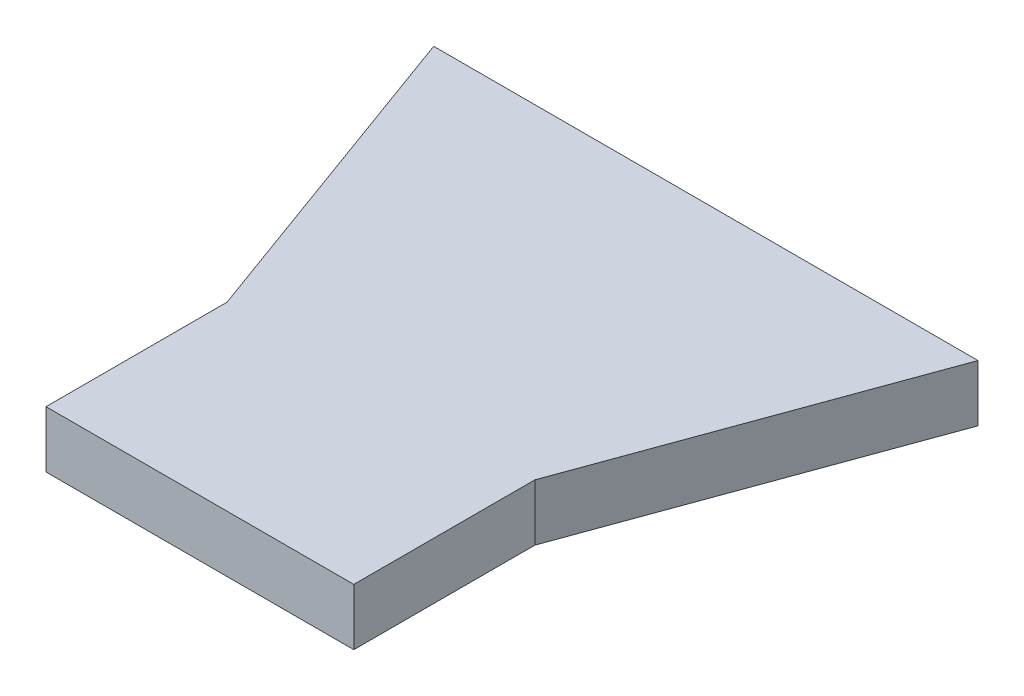
ISO-10303-21;
HEADER;
FILE_DESCRIPTION(('STEP AP214'),'2;1');
FILE_NAME('part.step','',(''),(''),'','','');
FILE_SCHEMA(('AUTOMOTIVE_DESIGN { 1 0 10303 214 1 1 1 1 }'));
ENDSEC;
DATA;
#1=APPLICATION_CONTEXT('core data for automotive mechanical design processes');
#2=APPLICATION_PROTOCOL_DEFINITION('international standard','automotive_design',2000,#1);
#3=PRODUCT_CONTEXT('',#1,'mechanical');
#4=PRODUCT('Part','Part','',(#3));
#5=PRODUCT_RELATED_PRODUCT_CATEGORY('part','',(#4));
#6=PRODUCT_DEFINITION_FORMATION('','',#4);
#7=PRODUCT_DEFINITION_CONTEXT('part definition',#1,'design');
#8=PRODUCT_DEFINITION('design','',#6,#7);
#9=PRODUCT_DEFINITION_SHAPE('','',#8);
#10=(LENGTH_UNIT() NAMED_UNIT(*) SI_UNIT(.MILLI.,.METRE.));
#11=(NAMED_UNIT(*) PLANE_ANGLE_UNIT() SI_UNIT($,.RADIAN.));
#12=(NAMED_UNIT(*) SI_UNIT($,.STERADIAN.) SOLID_ANGLE_UNIT());
#13=UNCERTAINTY_MEASURE_WITH_UNIT(LENGTH_MEASURE(1.E-05),#10,'distance_accuracy_value','');
#14=(GEOMETRIC_REPRESENTATION_CONTEXT(3) GLOBAL_UNCERTAINTY_ASSIGNED_CONTEXT((#13)) GLOBAL_UNIT_ASSIGNED_CONTEXT((#10,
#11,#12)) REPRESENTATION_CONTEXT('',''));
#15=CARTESIAN_POINT('',(0.,0.,0.));
#16=DIRECTION('',(0.,0.,1.));
#17=DIRECTION('',(1.,0.,0.));
#18=AXIS2_PLACEMENT_3D('',#15,#16,#17);
#19=CARTESIAN_POINT('',(0.,25.,0.));
#20=DIRECTION('',(1.,0.,0.));
#21=DIRECTION('',(0.,0.,-1.));
#22=AXIS2_PLACEMENT_3D('',#19,#20,#21);
#23=PLANE('',#22);
#24=DIRECTION('',(0.,0.,1.));
#25=VECTOR('',#24,1.);
#26=CARTESIAN_POINT('',(0.,0.,0.));
#27=LINE('',#26,#25);
#28=CARTESIAN_POINT('',(0.,0.,-80.));
#29=VERTEX_POINT('',#28);
#30=CARTESIAN_POINT('',(0.,0.,0.));
#31=VERTEX_POINT('',#30);
#32=EDGE_CURVE('E127',#29,#31,#27,.T.);
#33=ORIENTED_EDGE('',*,*,#32,.T.);
#34=DIRECTION('',(0.,-1.,0.));
#35=VECTOR('',#34,1.);
#36=CARTESIAN_POINT('',(0.,25.,0.));
#37=LINE('',#36,#35);
#38=CARTESIAN_POINT('',(0.,25.,0.));
#39=VERTEX_POINT('',#38);
#40=EDGE_CURVE('E11',#39,#31,#37,.T.);
#41=ORIENTED_EDGE('',*,*,#40,.F.);
#42=DIRECTION('',(0.,0.,1.));
#43=VECTOR('',#42,1.);
#44=CARTESIAN_POINT('',(0.,25.,0.));
#45=LINE('',#44,#43);
#46=CARTESIAN_POINT('',(0.,25.,-80.));
#47=VERTEX_POINT('',#46);
#48=EDGE_CURVE('E137',#47,#39,#45,.T.);
#49=ORIENTED_EDGE('',*,*,#48,.F.);
#50=DIRECTION('',(0.,-1.,0.));
#51=VECTOR('',#50,1.);
#52=CARTESIAN_POINT('',(0.,25.,-80.));
#53=LINE('',#52,#51);
#54=EDGE_CURVE('E123',#47,#29,#53,.T.);
#55=ORIENTED_EDGE('',*,*,#54,.T.);
#56=EDGE_LOOP('',(#33,#41,#49,#55));
#57=FACE_BOUND('',#56,.T.);
#58=ADVANCED_FACE('F43',(#57),#23,.F.);
#59=CARTESIAN_POINT('',(0.,25.,0.));
#60=DIRECTION('',(0.,0.,-1.));
#61=DIRECTION('',(-1.,0.,0.));
#62=AXIS2_PLACEMENT_3D('',#59,#60,#61);
#63=PLANE('',#62);
#64=DIRECTION('',(1.,0.,0.));
#65=VECTOR('',#64,1.);
#66=CARTESIAN_POINT('',(0.,0.,0.));
#67=LINE('',#66,#65);
#68=CARTESIAN_POINT('',(136.,0.,0.));
#69=VERTEX_POINT('',#68);
#70=EDGE_CURVE('E130',#31,#69,#67,.T.);
#71=ORIENTED_EDGE('',*,*,#70,.T.);
#72=DIRECTION('',(0.,-1.,0.));
#73=VECTOR('',#72,1.);
#74=CARTESIAN_POINT('',(136.,25.,0.));
#75=LINE('',#74,#73);
#76=CARTESIAN_POINT('',(136.,25.,0.));
#77=VERTEX_POINT('',#76);
#78=EDGE_CURVE('E51',#77,#69,#75,.T.);
#79=ORIENTED_EDGE('',*,*,#78,.F.);
#80=DIRECTION('',(1.,0.,0.));
#81=VECTOR('',#80,1.);
#82=CARTESIAN_POINT('',(0.,25.,0.));
#83=LINE('',#82,#81);
#84=EDGE_CURVE('E96',#39,#77,#83,.T.);
#85=ORIENTED_EDGE('',*,*,#84,.F.);
#86=ORIENTED_EDGE('',*,*,#40,.T.);
#87=EDGE_LOOP('',(#71,#79,#85,#86));
#88=FACE_BOUND('',#87,.T.);
#89=ADVANCED_FACE('F161',(#88),#63,.F.);
#90=CARTESIAN_POINT('',(136.,25.,0.));
#91=DIRECTION('',(-1.,0.,0.));
#92=DIRECTION('',(0.,0.,1.));
#93=AXIS2_PLACEMENT_3D('',#90,#91,#92);
#94=PLANE('',#93);
#95=DIRECTION('',(0.,0.,-1.));
#96=VECTOR('',#95,1.);
#97=CARTESIAN_POINT('',(136.,0.,0.));
#98=LINE('',#97,#96);
#99=CARTESIAN_POINT('',(136.,0.,-80.));
#100=VERTEX_POINT('',#99);
#101=EDGE_CURVE('E132',#69,#100,#98,.T.);
#102=ORIENTED_EDGE('',*,*,#101,.T.);
#103=DIRECTION('',(0.,-1.,0.));
#104=VECTOR('',#103,1.);
#105=CARTESIAN_POINT('',(136.,25.,-80.));
#106=LINE('',#105,#104);
#107=CARTESIAN_POINT('',(136.,25.,-80.));
#108=VERTEX_POINT('',#107);
#109=EDGE_CURVE('E118',#108,#100,#106,.T.);
#110=ORIENTED_EDGE('',*,*,#109,.F.);
#111=DIRECTION('',(0.,0.,-1.));
#112=VECTOR('',#111,1.);
#113=CARTESIAN_POINT('',(136.,25.,0.));
#114=LINE('',#113,#112);
#115=EDGE_CURVE('E109',#77,#108,#114,.T.);
#116=ORIENTED_EDGE('',*,*,#115,.F.);
#117=ORIENTED_EDGE('',*,*,#78,.T.);
#118=EDGE_LOOP('',(#102,#110,#116,#117));
#119=FACE_BOUND('',#118,.T.);
#120=ADVANCED_FACE('F143',(#119),#94,.F.);
#121=CARTESIAN_POINT('',(188.253518922524,25.,-223.565363326681));
#122=DIRECTION('',(-0.93969262078591,0.,-0.342020143325664));
#123=DIRECTION('',(-0.342020143325664,0.,0.93969262078591));
#124=AXIS2_PLACEMENT_3D('',#121,#122,#123);
#125=PLANE('',#124);
#126=DIRECTION('',(0.342020143325664,0.,-0.93969262078591));
#127=VECTOR('',#126,1.);
#128=CARTESIAN_POINT('',(188.253518922524,0.,-223.565363326681));
#129=LINE('',#128,#127);
#130=CARTESIAN_POINT('',(188.253518922524,0.,-223.565363326681));
#131=VERTEX_POINT('',#130);
#132=EDGE_CURVE('E117',#100,#131,#129,.T.);
#133=ORIENTED_EDGE('',*,*,#132,.T.);
#134=DIRECTION('',(0.,-1.,0.));
#135=VECTOR('',#134,1.);
#136=CARTESIAN_POINT('',(188.253518922524,25.,-223.565363326681));
#137=LINE('',#136,#135);
#138=CARTESIAN_POINT('',(188.253518922524,25.,-223.565363326681));
#139=VERTEX_POINT('',#138);
#140=EDGE_CURVE('E114',#139,#131,#137,.T.);
#141=ORIENTED_EDGE('',*,*,#140,.F.);
#142=DIRECTION('',(0.342020143325664,0.,-0.93969262078591));
#143=VECTOR('',#142,1.);
#144=CARTESIAN_POINT('',(188.253518922524,25.,-223.565363326681));
#145=LINE('',#144,#143);
#146=EDGE_CURVE('E103',#108,#139,#145,.T.);
#147=ORIENTED_EDGE('',*,*,#146,.F.);
#148=ORIENTED_EDGE('',*,*,#109,.T.);
#149=EDGE_LOOP('',(#133,#141,#147,#148));
#150=FACE_BOUND('',#149,.T.);
#151=ADVANCED_FACE('F115',(#150),#125,.F.);
#152=CARTESIAN_POINT('',(-52.2535189225237,25.,-223.565363326681));
#153=DIRECTION('',(0.,0.,1.));
#154=DIRECTION('',(1.,0.,0.));
#155=AXIS2_PLACEMENT_3D('',#152,#153,#154);
#156=PLANE('',#155);
#157=DIRECTION('',(-1.,0.,0.));
#158=VECTOR('',#157,1.);
#159=CARTESIAN_POINT('',(-52.2535189225237,0.,-223.565363326681));
#160=LINE('',#159,#158);
#161=CARTESIAN_POINT('',(-52.2535189225237,0.,-223.565363326681));
#162=VERTEX_POINT('',#161);
#163=EDGE_CURVE('E82',#131,#162,#160,.T.);
#164=ORIENTED_EDGE('',*,*,#163,.T.);
#165=DIRECTION('',(0.,-1.,0.));
#166=VECTOR('',#165,1.);
#167=CARTESIAN_POINT('',(-52.2535189225237,25.,-223.565363326681));
#168=LINE('',#167,#166);
#169=CARTESIAN_POINT('',(-52.2535189225237,25.,-223.565363326681));
#170=VERTEX_POINT('',#169);
#171=EDGE_CURVE('E119',#170,#162,#168,.T.);
#172=ORIENTED_EDGE('',*,*,#171,.F.);
#173=DIRECTION('',(-1.,0.,0.));
#174=VECTOR('',#173,1.);
#175=CARTESIAN_POINT('',(-52.2535189225237,25.,-223.565363326681));
#176=LINE('',#175,#174);
#177=EDGE_CURVE('E107',#139,#170,#176,.T.);
#178=ORIENTED_EDGE('',*,*,#177,.F.);
#179=ORIENTED_EDGE('',*,*,#140,.T.);
#180=EDGE_LOOP('',(#164,#172,#178,#179));
#181=FACE_BOUND('',#180,.T.);
#182=ADVANCED_FACE('F121',(#181),#156,.F.);
#183=CARTESIAN_POINT('',(0.,25.,-80.));
#184=DIRECTION('',(0.93969262078591,0.,-0.342020143325664));
#185=DIRECTION('',(-0.342020143325664,0.,-0.93969262078591));
#186=AXIS2_PLACEMENT_3D('',#183,#184,#185);
#187=PLANE('',#186);
#188=DIRECTION('',(0.342020143325664,0.,0.93969262078591));
#189=VECTOR('',#188,1.);
#190=CARTESIAN_POINT('',(0.,0.,-80.));
#191=LINE('',#190,#189);
#192=EDGE_CURVE('E88',#162,#29,#191,.T.);
#193=ORIENTED_EDGE('',*,*,#192,.T.);
#194=ORIENTED_EDGE('',*,*,#54,.F.);
#195=DIRECTION('',(0.342020143325664,0.,0.93969262078591));
#196=VECTOR('',#195,1.);
#197=CARTESIAN_POINT('',(0.,25.,-80.));
#198=LINE('',#197,#196);
#199=EDGE_CURVE('E59',#170,#47,#198,.T.);
#200=ORIENTED_EDGE('',*,*,#199,.F.);
#201=ORIENTED_EDGE('',*,*,#171,.T.);
#202=EDGE_LOOP('',(#193,#194,#200,#201));
#203=FACE_BOUND('',#202,.T.);
#204=ADVANCED_FACE('F150',(#203),#187,.F.);
#205=CARTESIAN_POINT('',(0.,25.,0.));
#206=DIRECTION('',(0.,-1.,0.));
#207=DIRECTION('',(0.,0.,-1.));
#208=AXIS2_PLACEMENT_3D('',#205,#206,#207);
#209=PLANE('',#208);
#210=ORIENTED_EDGE('',*,*,#48,.T.);
#211=ORIENTED_EDGE('',*,*,#84,.T.);
#212=ORIENTED_EDGE('',*,*,#115,.T.);
#213=ORIENTED_EDGE('',*,*,#146,.T.);
#214=ORIENTED_EDGE('',*,*,#177,.T.);
#215=ORIENTED_EDGE('',*,*,#199,.T.);
#216=EDGE_LOOP('',(#210,#211,#212,#213,#214,#215));
#217=FACE_BOUND('',#216,.T.);
#218=ADVANCED_FACE('F105',(#217),#209,.F.);
#219=CARTESIAN_POINT('',(0.,0.,0.));
#220=DIRECTION('',(0.,-1.,0.));
#221=DIRECTION('',(0.,0.,-1.));
#222=AXIS2_PLACEMENT_3D('',#219,#220,#221);
#223=PLANE('',#222);
#224=ORIENTED_EDGE('',*,*,#32,.F.);
#225=ORIENTED_EDGE('',*,*,#192,.F.);
#226=ORIENTED_EDGE('',*,*,#163,.F.);
#227=ORIENTED_EDGE('',*,*,#132,.F.);
#228=ORIENTED_EDGE('',*,*,#101,.F.);
#229=ORIENTED_EDGE('',*,*,#70,.F.);
#230=EDGE_LOOP('',(#224,#225,#226,#227,#228,#229));
#231=FACE_BOUND('',#230,.T.);
#232=ADVANCED_FACE('F146',(#231),#223,.T.);
#233=CLOSED_SHELL('',(#58,#89,#120,#151,#182,#204,#218,#232));
#234=MANIFOLD_SOLID_BREP('B2',#233);
#235=ADVANCED_BREP_SHAPE_REPRESENTATION('',(#18,#234),#14);
#236=SHAPE_DEFINITION_REPRESENTATION(#9,#235);
ENDSEC;
END-ISO-10303-21;
